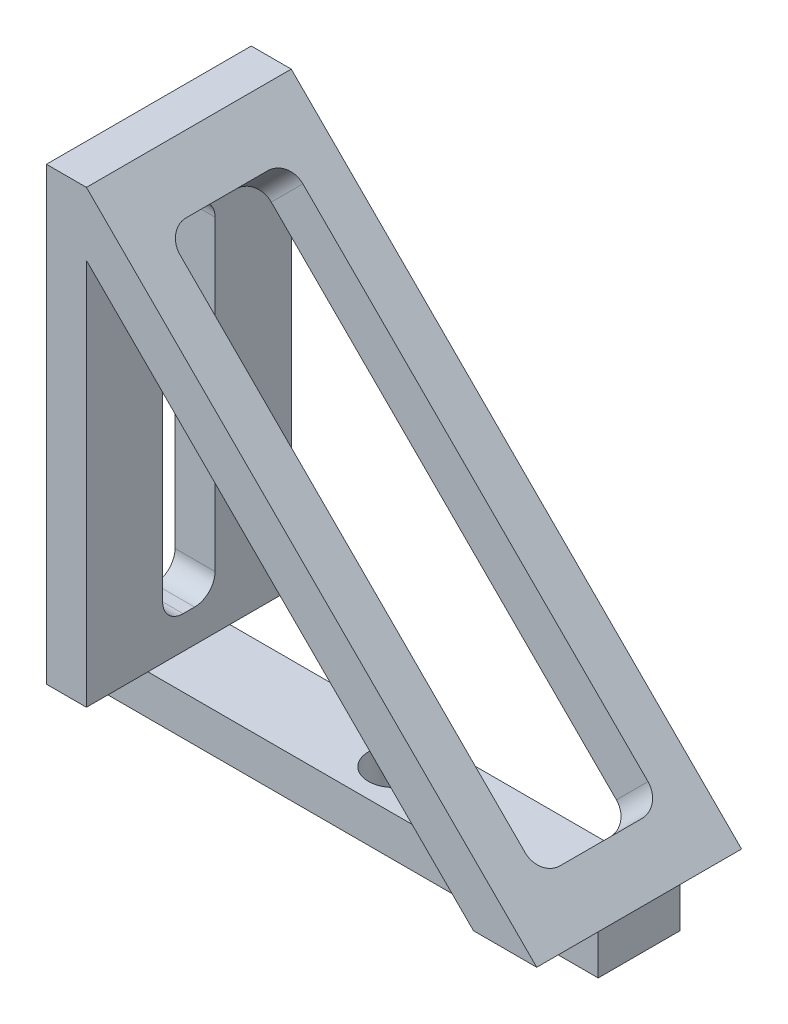
ISO-10303-21;
HEADER;
FILE_DESCRIPTION(('STEP AP214'),'2;1');
FILE_NAME('part.step','',(''),(''),'','','');
FILE_SCHEMA(('AUTOMOTIVE_DESIGN { 1 0 10303 214 1 1 1 1 }'));
ENDSEC;
DATA;
#1=APPLICATION_CONTEXT('core data for automotive mechanical design processes');
#2=APPLICATION_PROTOCOL_DEFINITION('international standard','automotive_design',2000,#1);
#3=PRODUCT_CONTEXT('',#1,'mechanical');
#4=PRODUCT('Part','Part','',(#3));
#5=PRODUCT_RELATED_PRODUCT_CATEGORY('part','',(#4));
#6=PRODUCT_DEFINITION_FORMATION('','',#4);
#7=PRODUCT_DEFINITION_CONTEXT('part definition',#1,'design');
#8=PRODUCT_DEFINITION('design','',#6,#7);
#9=PRODUCT_DEFINITION_SHAPE('','',#8);
#10=(LENGTH_UNIT() NAMED_UNIT(*) SI_UNIT(.MILLI.,.METRE.));
#11=(NAMED_UNIT(*) PLANE_ANGLE_UNIT() SI_UNIT($,.RADIAN.));
#12=(NAMED_UNIT(*) SI_UNIT($,.STERADIAN.) SOLID_ANGLE_UNIT());
#13=UNCERTAINTY_MEASURE_WITH_UNIT(LENGTH_MEASURE(1.E-05),#10,'distance_accuracy_value','');
#14=(GEOMETRIC_REPRESENTATION_CONTEXT(3) GLOBAL_UNCERTAINTY_ASSIGNED_CONTEXT((#13)) GLOBAL_UNIT_ASSIGNED_CONTEXT((#10,
#11,#12)) REPRESENTATION_CONTEXT('',''));
#15=CARTESIAN_POINT('',(0.,0.,0.));
#16=DIRECTION('',(0.,0.,1.));
#17=DIRECTION('',(1.,0.,0.));
#18=AXIS2_PLACEMENT_3D('',#15,#16,#17);
#19=CARTESIAN_POINT('',(-6.20000000000001,-6.19999999999997,15.875));
#20=DIRECTION('',(0.,1.,0.));
#21=DIRECTION('',(0.,0.,1.));
#22=AXIS2_PLACEMENT_3D('',#19,#20,#21);
#23=PLANE('',#22);
#24=DIRECTION('',(0.,0.,-1.));
#25=VECTOR('',#24,1.);
#26=CARTESIAN_POINT('',(69.8,-6.19999999999997,15.875));
#27=LINE('',#26,#25);
#28=CARTESIAN_POINT('',(69.8,-6.19999999999997,6.35));
#29=VERTEX_POINT('',#28);
#30=CARTESIAN_POINT('',(69.8,-6.19999999999997,-6.35));
#31=VERTEX_POINT('',#30);
#32=EDGE_CURVE('E246',#29,#31,#27,.T.);
#33=ORIENTED_EDGE('',*,*,#32,.F.);
#34=DIRECTION('',(1.,0.,0.));
#35=VECTOR('',#34,1.);
#36=CARTESIAN_POINT('',(-6.20100000000001,-6.19999999999997,6.35));
#37=LINE('',#36,#35);
#38=CARTESIAN_POINT('',(-6.20000000000001,-6.19999999999997,6.35));
#39=VERTEX_POINT('',#38);
#40=EDGE_CURVE('E228',#39,#29,#37,.T.);
#41=ORIENTED_EDGE('',*,*,#40,.F.);
#42=DIRECTION('',(0.,0.,-1.));
#43=VECTOR('',#42,1.);
#44=CARTESIAN_POINT('',(-6.20000000000001,-6.19999999999997,15.875));
#45=LINE('',#44,#43);
#46=CARTESIAN_POINT('',(-6.20000000000001,-6.19999999999997,-6.35));
#47=VERTEX_POINT('',#46);
#48=EDGE_CURVE('E255',#39,#47,#45,.T.);
#49=ORIENTED_EDGE('',*,*,#48,.T.);
#50=DIRECTION('',(1.,0.,0.));
#51=VECTOR('',#50,1.);
#52=CARTESIAN_POINT('',(-6.20100000000001,-6.19999999999997,-6.35));
#53=LINE('',#52,#51);
#54=EDGE_CURVE('E254',#47,#31,#53,.T.);
#55=ORIENTED_EDGE('',*,*,#54,.T.);
#56=EDGE_LOOP('',(#33,#41,#49,#55));
#57=FACE_BOUND('',#56,.T.);
#58=CARTESIAN_POINT('',(31.8,-6.19999999999997,0.));
#59=DIRECTION('',(0.,-1.,0.));
#60=DIRECTION('',(0.,0.,-1.));
#61=AXIS2_PLACEMENT_3D('',#58,#59,#60);
#62=CIRCLE('',#61,3.96874999999999);
#63=CARTESIAN_POINT('',(31.8,-6.19999999999997,-3.96874999999999));
#64=VERTEX_POINT('',#63);
#65=EDGE_CURVE('E603',#64,#64,#62,.T.);
#66=ORIENTED_EDGE('',*,*,#65,.F.);
#67=EDGE_LOOP('',(#66));
#68=FACE_BOUND('',#67,.T.);
#69=ADVANCED_FACE('F37',(#57,#68),#23,.F.);
#70=CARTESIAN_POINT('',(0.,0.,15.875));
#71=DIRECTION('',(0.,0.,-1.));
#72=DIRECTION('',(-1.,0.,0.));
#73=AXIS2_PLACEMENT_3D('',#70,#71,#72);
#74=PLANE('',#73);
#75=DIRECTION('',(0.,-1.,0.));
#76=VECTOR('',#75,1.);
#77=CARTESIAN_POINT('',(-6.20000000000001,69.8,15.875));
#78=LINE('',#77,#76);
#79=CARTESIAN_POINT('',(-6.20000000000001,69.8,15.875));
#80=VERTEX_POINT('',#79);
#81=CARTESIAN_POINT('',(-6.20000000000001,0.,15.875));
#82=VERTEX_POINT('',#81);
#83=EDGE_CURVE('E418',#80,#82,#78,.T.);
#84=ORIENTED_EDGE('',*,*,#83,.T.);
#85=DIRECTION('',(1.,0.,0.));
#86=VECTOR('',#85,1.);
#87=CARTESIAN_POINT('',(-6.20100000000001,0.,15.875));
#88=LINE('',#87,#86);
#89=CARTESIAN_POINT('',(0.,0.,15.875));
#90=VERTEX_POINT('',#89);
#91=EDGE_CURVE('E451',#82,#90,#88,.T.);
#92=ORIENTED_EDGE('',*,*,#91,.T.);
#93=DIRECTION('',(0.,-1.,0.));
#94=VECTOR('',#93,1.);
#95=CARTESIAN_POINT('',(0.,0.,15.875));
#96=LINE('',#95,#94);
#97=CARTESIAN_POINT('',(0.,60.,15.875));
#98=VERTEX_POINT('',#97);
#99=EDGE_CURVE('E390',#98,#90,#96,.T.);
#100=ORIENTED_EDGE('',*,*,#99,.F.);
#101=DIRECTION('',(-0.707106781186547,0.707106781186547,0.));
#102=VECTOR('',#101,1.);
#103=CARTESIAN_POINT('',(0.,60.,15.875));
#104=LINE('',#103,#102);
#105=CARTESIAN_POINT('',(60.,0.,15.875));
#106=VERTEX_POINT('',#105);
#107=EDGE_CURVE('E393',#106,#98,#104,.T.);
#108=ORIENTED_EDGE('',*,*,#107,.F.);
#109=CARTESIAN_POINT('',(69.8,0.,15.875));
#110=VERTEX_POINT('',#109);
#111=EDGE_CURVE('E575',#106,#110,#88,.T.);
#112=ORIENTED_EDGE('',*,*,#111,.T.);
#113=DIRECTION('',(-0.707106781186548,0.707106781186547,0.));
#114=VECTOR('',#113,1.);
#115=CARTESIAN_POINT('',(0.,69.8,15.875));
#116=LINE('',#115,#114);
#117=CARTESIAN_POINT('',(0.,69.8,15.875));
#118=VERTEX_POINT('',#117);
#119=EDGE_CURVE('E412',#110,#118,#116,.T.);
#120=ORIENTED_EDGE('',*,*,#119,.T.);
#121=DIRECTION('',(-1.,0.,0.));
#122=VECTOR('',#121,1.);
#123=CARTESIAN_POINT('',(-6.20000000000001,69.8,15.875));
#124=LINE('',#123,#122);
#125=EDGE_CURVE('E415',#118,#80,#124,.T.);
#126=ORIENTED_EDGE('',*,*,#125,.T.);
#127=EDGE_LOOP('',(#84,#92,#100,#108,#112,#120,#126));
#128=FACE_BOUND('',#127,.T.);
#129=ADVANCED_FACE('F486',(#128),#74,.F.);
#130=CARTESIAN_POINT('',(0.,0.,-15.875));
#131=DIRECTION('',(0.,0.,-1.));
#132=DIRECTION('',(-1.,0.,0.));
#133=AXIS2_PLACEMENT_3D('',#130,#131,#132);
#134=PLANE('',#133);
#135=DIRECTION('',(1.,0.,0.));
#136=VECTOR('',#135,1.);
#137=CARTESIAN_POINT('',(-6.20100000000001,0.,-15.875));
#138=LINE('',#137,#136);
#139=CARTESIAN_POINT('',(-6.20000000000001,0.,-15.875));
#140=VERTEX_POINT('',#139);
#141=CARTESIAN_POINT('',(0.,0.,-15.875));
#142=VERTEX_POINT('',#141);
#143=EDGE_CURVE('E435',#140,#142,#138,.T.);
#144=ORIENTED_EDGE('',*,*,#143,.F.);
#145=DIRECTION('',(0.,-1.,0.));
#146=VECTOR('',#145,1.);
#147=CARTESIAN_POINT('',(-6.20000000000001,69.8,-15.875));
#148=LINE('',#147,#146);
#149=CARTESIAN_POINT('',(-6.20000000000001,69.8,-15.875));
#150=VERTEX_POINT('',#149);
#151=EDGE_CURVE('E416',#150,#140,#148,.T.);
#152=ORIENTED_EDGE('',*,*,#151,.F.);
#153=DIRECTION('',(-1.,0.,0.));
#154=VECTOR('',#153,1.);
#155=CARTESIAN_POINT('',(-6.20000000000001,69.8,-15.875));
#156=LINE('',#155,#154);
#157=CARTESIAN_POINT('',(0.,69.8,-15.875));
#158=VERTEX_POINT('',#157);
#159=EDGE_CURVE('E423',#158,#150,#156,.T.);
#160=ORIENTED_EDGE('',*,*,#159,.F.);
#161=DIRECTION('',(-0.707106781186548,0.707106781186547,0.));
#162=VECTOR('',#161,1.);
#163=CARTESIAN_POINT('',(0.,69.8,-15.875));
#164=LINE('',#163,#162);
#165=CARTESIAN_POINT('',(69.8,0.,-15.875));
#166=VERTEX_POINT('',#165);
#167=EDGE_CURVE('E411',#166,#158,#164,.T.);
#168=ORIENTED_EDGE('',*,*,#167,.F.);
#169=CARTESIAN_POINT('',(60.,0.,-15.875));
#170=VERTEX_POINT('',#169);
#171=EDGE_CURVE('E439',#170,#166,#138,.T.);
#172=ORIENTED_EDGE('',*,*,#171,.F.);
#173=DIRECTION('',(-0.707106781186547,0.707106781186547,0.));
#174=VECTOR('',#173,1.);
#175=CARTESIAN_POINT('',(0.,60.,-15.875));
#176=LINE('',#175,#174);
#177=CARTESIAN_POINT('',(0.,60.,-15.875));
#178=VERTEX_POINT('',#177);
#179=EDGE_CURVE('E394',#170,#178,#176,.T.);
#180=ORIENTED_EDGE('',*,*,#179,.T.);
#181=DIRECTION('',(0.,-1.,0.));
#182=VECTOR('',#181,1.);
#183=CARTESIAN_POINT('',(0.,0.,-15.875));
#184=LINE('',#183,#182);
#185=EDGE_CURVE('E389',#178,#142,#184,.T.);
#186=ORIENTED_EDGE('',*,*,#185,.T.);
#187=EDGE_LOOP('',(#144,#152,#160,#168,#172,#180,#186));
#188=FACE_BOUND('',#187,.T.);
#189=ADVANCED_FACE('F433',(#188),#134,.T.);
#190=CARTESIAN_POINT('',(0.,69.8,15.875));
#191=DIRECTION('',(-0.707106781186547,-0.707106781186548,0.));
#192=DIRECTION('',(0.707106781186548,-0.707106781186547,0.));
#193=AXIS2_PLACEMENT_3D('',#190,#191,#192);
#194=PLANE('',#193);
#195=DIRECTION('',(0.707106781186548,-0.707106781186547,0.));
#196=VECTOR('',#195,1.);
#197=CARTESIAN_POINT('',(63.8913780286485,5.90862197135156,9.525));
#198=LINE('',#197,#196);
#199=CARTESIAN_POINT('',(8.15368600161884,61.6463139983812,9.525));
#200=VERTEX_POINT('',#199);
#201=CARTESIAN_POINT('',(61.6463139983812,8.15368600161885,9.525));
#202=VERTEX_POINT('',#201);
#203=EDGE_CURVE('E380',#200,#202,#198,.T.);
#204=ORIENTED_EDGE('',*,*,#203,.F.);
#205=CARTESIAN_POINT('',(8.15368600161884,61.6463139983812,6.35));
#206=DIRECTION('',(-0.707106781186547,-0.707106781186548,0.));
#207=DIRECTION('',(0.707106781186548,-0.707106781186547,0.));
#208=AXIS2_PLACEMENT_3D('',#205,#206,#207);
#209=CIRCLE('',#208,3.175);
#210=CARTESIAN_POINT('',(5.90862197135155,63.8913780286485,6.35));
#211=VERTEX_POINT('',#210);
#212=EDGE_CURVE('E300',#200,#211,#209,.T.);
#213=ORIENTED_EDGE('',*,*,#212,.T.);
#214=DIRECTION('',(0.,0.,1.));
#215=VECTOR('',#214,1.);
#216=CARTESIAN_POINT('',(5.90862197135155,63.8913780286485,9.525));
#217=LINE('',#216,#215);
#218=CARTESIAN_POINT('',(5.90862197135155,63.8913780286485,-6.34999999999999));
#219=VERTEX_POINT('',#218);
#220=EDGE_CURVE('E377',#219,#211,#217,.T.);
#221=ORIENTED_EDGE('',*,*,#220,.F.);
#222=CARTESIAN_POINT('',(8.15368600161883,61.6463139983812,-6.35));
#223=DIRECTION('',(-0.707106781186547,-0.707106781186548,0.));
#224=DIRECTION('',(0.707106781186548,-0.707106781186547,0.));
#225=AXIS2_PLACEMENT_3D('',#222,#223,#224);
#226=CIRCLE('',#225,3.175);
#227=CARTESIAN_POINT('',(8.15368600161884,61.6463139983812,-9.525));
#228=VERTEX_POINT('',#227);
#229=EDGE_CURVE('E296',#219,#228,#226,.T.);
#230=ORIENTED_EDGE('',*,*,#229,.T.);
#231=DIRECTION('',(-0.707106781186548,0.707106781186547,0.));
#232=VECTOR('',#231,1.);
#233=CARTESIAN_POINT('',(63.8913780286485,5.90862197135156,-9.525));
#234=LINE('',#233,#232);
#235=CARTESIAN_POINT('',(61.6463139983812,8.15368600161885,-9.525));
#236=VERTEX_POINT('',#235);
#237=EDGE_CURVE('E374',#236,#228,#234,.T.);
#238=ORIENTED_EDGE('',*,*,#237,.F.);
#239=CARTESIAN_POINT('',(61.6463139983812,8.15368600161884,-6.35));
#240=DIRECTION('',(-0.707106781186547,-0.707106781186548,0.));
#241=DIRECTION('',(0.707106781186548,-0.707106781186547,0.));
#242=AXIS2_PLACEMENT_3D('',#239,#240,#241);
#243=CIRCLE('',#242,3.175);
#244=CARTESIAN_POINT('',(63.8913780286485,5.90862197135156,-6.34999999999999));
#245=VERTEX_POINT('',#244);
#246=EDGE_CURVE('E292',#236,#245,#243,.T.);
#247=ORIENTED_EDGE('',*,*,#246,.T.);
#248=DIRECTION('',(0.,0.,-1.));
#249=VECTOR('',#248,1.);
#250=CARTESIAN_POINT('',(63.8913780286485,5.90862197135156,9.525));
#251=LINE('',#250,#249);
#252=CARTESIAN_POINT('',(63.8913780286485,5.90862197135156,6.35));
#253=VERTEX_POINT('',#252);
#254=EDGE_CURVE('E383',#253,#245,#251,.T.);
#255=ORIENTED_EDGE('',*,*,#254,.F.);
#256=CARTESIAN_POINT('',(61.6463139983812,8.15368600161884,6.35));
#257=DIRECTION('',(-0.707106781186547,-0.707106781186548,0.));
#258=DIRECTION('',(0.707106781186548,-0.707106781186547,0.));
#259=AXIS2_PLACEMENT_3D('',#256,#257,#258);
#260=CIRCLE('',#259,3.175);
#261=EDGE_CURVE('E288',#253,#202,#260,.T.);
#262=ORIENTED_EDGE('',*,*,#261,.T.);
#263=EDGE_LOOP('',(#204,#213,#221,#230,#238,#247,#255,#262));
#264=FACE_BOUND('',#263,.T.);
#265=ORIENTED_EDGE('',*,*,#167,.T.);
#266=DIRECTION('',(0.,0.,-1.));
#267=VECTOR('',#266,1.);
#268=CARTESIAN_POINT('',(0.,69.8,15.875));
#269=LINE('',#268,#267);
#270=EDGE_CURVE('E265',#118,#158,#269,.T.);
#271=ORIENTED_EDGE('',*,*,#270,.F.);
#272=ORIENTED_EDGE('',*,*,#119,.F.);
#273=DIRECTION('',(0.,0.,-1.));
#274=VECTOR('',#273,1.);
#275=CARTESIAN_POINT('',(69.8,0.,15.875));
#276=LINE('',#275,#274);
#277=CARTESIAN_POINT('',(69.8,0.,6.35));
#278=VERTEX_POINT('',#277);
#279=EDGE_CURVE('E256',#110,#278,#276,.T.);
#280=ORIENTED_EDGE('',*,*,#279,.T.);
#281=CARTESIAN_POINT('',(69.8,0.,-6.35));
#282=VERTEX_POINT('',#281);
#283=EDGE_CURVE('E248',#278,#282,#276,.T.);
#284=ORIENTED_EDGE('',*,*,#283,.T.);
#285=DIRECTION('',(0.,0.,1.));
#286=VECTOR('',#285,1.);
#287=CARTESIAN_POINT('',(69.8,0.,-15.875));
#288=LINE('',#287,#286);
#289=EDGE_CURVE('E559',#166,#282,#288,.T.);
#290=ORIENTED_EDGE('',*,*,#289,.F.);
#291=EDGE_LOOP('',(#265,#271,#272,#280,#284,#290));
#292=FACE_BOUND('',#291,.T.);
#293=ADVANCED_FACE('F501',(#264,#292),#194,.F.);
#294=CARTESIAN_POINT('',(-6.20000000000001,69.8,15.875));
#295=DIRECTION('',(0.,-1.,0.));
#296=DIRECTION('',(1.,0.,0.));
#297=AXIS2_PLACEMENT_3D('',#294,#295,#296);
#298=PLANE('',#297);
#299=ORIENTED_EDGE('',*,*,#159,.T.);
#300=DIRECTION('',(0.,0.,-1.));
#301=VECTOR('',#300,1.);
#302=CARTESIAN_POINT('',(-6.20000000000001,69.8,15.875));
#303=LINE('',#302,#301);
#304=EDGE_CURVE('E258',#80,#150,#303,.T.);
#305=ORIENTED_EDGE('',*,*,#304,.F.);
#306=ORIENTED_EDGE('',*,*,#125,.F.);
#307=ORIENTED_EDGE('',*,*,#270,.T.);
#308=EDGE_LOOP('',(#299,#305,#306,#307));
#309=FACE_BOUND('',#308,.T.);
#310=ADVANCED_FACE('F498',(#309),#298,.F.);
#311=CARTESIAN_POINT('',(-6.20000000000001,69.8,15.875));
#312=DIRECTION('',(1.,0.,0.));
#313=DIRECTION('',(0.,0.,-1.));
#314=AXIS2_PLACEMENT_3D('',#311,#312,#313);
#315=PLANE('',#314);
#316=DIRECTION('',(0.,0.,1.));
#317=VECTOR('',#316,1.);
#318=CARTESIAN_POINT('',(-6.20000000000001,5.08,4.064));
#319=LINE('',#318,#317);
#320=CARTESIAN_POINT('',(-6.20000000000001,5.08,-0.889));
#321=VERTEX_POINT('',#320);
#322=CARTESIAN_POINT('',(-6.20000000000001,5.08,0.889));
#323=VERTEX_POINT('',#322);
#324=EDGE_CURVE('E454',#321,#323,#319,.T.);
#325=ORIENTED_EDGE('',*,*,#324,.F.);
#326=CARTESIAN_POINT('',(-6.20000000000001,8.255,-0.889));
#327=DIRECTION('',(1.,0.,0.));
#328=DIRECTION('',(0.,0.,-1.));
#329=AXIS2_PLACEMENT_3D('',#326,#327,#328);
#330=CIRCLE('',#329,3.175);
#331=CARTESIAN_POINT('',(-6.20000000000001,8.255,-4.064));
#332=VERTEX_POINT('',#331);
#333=EDGE_CURVE('E329',#321,#332,#330,.T.);
#334=ORIENTED_EDGE('',*,*,#333,.T.);
#335=DIRECTION('',(0.,-1.,0.));
#336=VECTOR('',#335,1.);
#337=CARTESIAN_POINT('',(-6.20000000000001,5.08,-4.064));
#338=LINE('',#337,#336);
#339=CARTESIAN_POINT('',(-6.20000000000001,55.825,-4.064));
#340=VERTEX_POINT('',#339);
#341=EDGE_CURVE('E344',#340,#332,#338,.T.);
#342=ORIENTED_EDGE('',*,*,#341,.F.);
#343=CARTESIAN_POINT('',(-6.20000000000001,55.825,-0.889));
#344=DIRECTION('',(1.,0.,0.));
#345=DIRECTION('',(0.,0.,-1.));
#346=AXIS2_PLACEMENT_3D('',#343,#344,#345);
#347=CIRCLE('',#346,3.175);
#348=CARTESIAN_POINT('',(-6.20000000000001,59.,-0.889));
#349=VERTEX_POINT('',#348);
#350=EDGE_CURVE('E11',#340,#349,#347,.T.);
#351=ORIENTED_EDGE('',*,*,#350,.T.);
#352=DIRECTION('',(0.,0.,-1.));
#353=VECTOR('',#352,1.);
#354=CARTESIAN_POINT('',(-6.20000000000001,59.,4.064));
#355=LINE('',#354,#353);
#356=CARTESIAN_POINT('',(-6.20000000000001,59.,0.889));
#357=VERTEX_POINT('',#356);
#358=EDGE_CURVE('E353',#357,#349,#355,.T.);
#359=ORIENTED_EDGE('',*,*,#358,.F.);
#360=CARTESIAN_POINT('',(-6.20000000000001,55.825,0.889));
#361=DIRECTION('',(1.,0.,0.));
#362=DIRECTION('',(0.,0.,-1.));
#363=AXIS2_PLACEMENT_3D('',#360,#361,#362);
#364=CIRCLE('',#363,3.175);
#365=CARTESIAN_POINT('',(-6.20000000000001,55.825,4.064));
#366=VERTEX_POINT('',#365);
#367=EDGE_CURVE('E332',#357,#366,#364,.T.);
#368=ORIENTED_EDGE('',*,*,#367,.T.);
#369=DIRECTION('',(0.,1.,0.));
#370=VECTOR('',#369,1.);
#371=CARTESIAN_POINT('',(-6.20000000000001,5.08,4.064));
#372=LINE('',#371,#370);
#373=CARTESIAN_POINT('',(-6.20000000000001,8.255,4.064));
#374=VERTEX_POINT('',#373);
#375=EDGE_CURVE('E450',#374,#366,#372,.T.);
#376=ORIENTED_EDGE('',*,*,#375,.F.);
#377=CARTESIAN_POINT('',(-6.20000000000001,8.255,0.889));
#378=DIRECTION('',(1.,0.,0.));
#379=DIRECTION('',(0.,0.,-1.));
#380=AXIS2_PLACEMENT_3D('',#377,#378,#379);
#381=CIRCLE('',#380,3.175);
#382=EDGE_CURVE('E325',#374,#323,#381,.T.);
#383=ORIENTED_EDGE('',*,*,#382,.T.);
#384=EDGE_LOOP('',(#325,#334,#342,#351,#359,#368,#376,#383));
#385=FACE_BOUND('',#384,.T.);
#386=ORIENTED_EDGE('',*,*,#48,.F.);
#387=DIRECTION('',(0.,-1.,0.));
#388=VECTOR('',#387,1.);
#389=CARTESIAN_POINT('',(-6.20000000000001,-6.19999999999997,6.35));
#390=LINE('',#389,#388);
#391=CARTESIAN_POINT('',(-6.20000000000001,0.,6.35));
#392=VERTEX_POINT('',#391);
#393=EDGE_CURVE('E235',#392,#39,#390,.T.);
#394=ORIENTED_EDGE('',*,*,#393,.F.);
#395=DIRECTION('',(0.,0.,-1.));
#396=VECTOR('',#395,1.);
#397=CARTESIAN_POINT('',(-6.20000000000001,0.,15.875));
#398=LINE('',#397,#396);
#399=EDGE_CURVE('E250',#82,#392,#398,.T.);
#400=ORIENTED_EDGE('',*,*,#399,.F.);
#401=ORIENTED_EDGE('',*,*,#83,.F.);
#402=ORIENTED_EDGE('',*,*,#304,.T.);
#403=ORIENTED_EDGE('',*,*,#151,.T.);
#404=DIRECTION('',(0.,0.,-1.));
#405=VECTOR('',#404,1.);
#406=CARTESIAN_POINT('',(-6.20000000000001,0.,-15.875));
#407=LINE('',#406,#405);
#408=CARTESIAN_POINT('',(-6.20000000000001,0.,-6.35));
#409=VERTEX_POINT('',#408);
#410=EDGE_CURVE('E428',#409,#140,#407,.T.);
#411=ORIENTED_EDGE('',*,*,#410,.F.);
#412=DIRECTION('',(0.,1.,0.));
#413=VECTOR('',#412,1.);
#414=CARTESIAN_POINT('',(-6.20000000000001,-6.19999999999997,-6.35));
#415=LINE('',#414,#413);
#416=EDGE_CURVE('E583',#47,#409,#415,.T.);
#417=ORIENTED_EDGE('',*,*,#416,.F.);
#418=EDGE_LOOP('',(#386,#394,#400,#401,#402,#403,#411,#417));
#419=FACE_BOUND('',#418,.T.);
#420=ADVANCED_FACE('F351',(#385,#419),#315,.F.);
#421=CARTESIAN_POINT('',(69.8,0.,15.875));
#422=DIRECTION('',(-1.,0.,0.));
#423=DIRECTION('',(0.,0.,1.));
#424=AXIS2_PLACEMENT_3D('',#421,#422,#423);
#425=PLANE('',#424);
#426=ORIENTED_EDGE('',*,*,#283,.F.);
#427=DIRECTION('',(0.,1.,0.));
#428=VECTOR('',#427,1.);
#429=CARTESIAN_POINT('',(69.8,-6.19999999999997,6.35));
#430=LINE('',#429,#428);
#431=EDGE_CURVE('E232',#29,#278,#430,.T.);
#432=ORIENTED_EDGE('',*,*,#431,.F.);
#433=ORIENTED_EDGE('',*,*,#32,.T.);
#434=DIRECTION('',(0.,-1.,0.));
#435=VECTOR('',#434,1.);
#436=CARTESIAN_POINT('',(69.8,-6.19999999999997,-6.35));
#437=LINE('',#436,#435);
#438=EDGE_CURVE('E444',#282,#31,#437,.T.);
#439=ORIENTED_EDGE('',*,*,#438,.F.);
#440=EDGE_LOOP('',(#426,#432,#433,#439));
#441=FACE_BOUND('',#440,.T.);
#442=ADVANCED_FACE('F244',(#441),#425,.F.);
#443=CARTESIAN_POINT('',(0.,0.,15.875));
#444=DIRECTION('',(1.,0.,0.));
#445=DIRECTION('',(0.,0.,-1.));
#446=AXIS2_PLACEMENT_3D('',#443,#444,#445);
#447=PLANE('',#446);
#448=DIRECTION('',(0.,1.,0.));
#449=VECTOR('',#448,1.);
#450=CARTESIAN_POINT('',(0.,5.08,-4.064));
#451=LINE('',#450,#449);
#452=CARTESIAN_POINT('',(0.,8.255,-4.064));
#453=VERTEX_POINT('',#452);
#454=CARTESIAN_POINT('',(0.,55.825,-4.064));
#455=VERTEX_POINT('',#454);
#456=EDGE_CURVE('E337',#453,#455,#451,.T.);
#457=ORIENTED_EDGE('',*,*,#456,.F.);
#458=CARTESIAN_POINT('',(0.,8.255,-0.889));
#459=DIRECTION('',(1.,0.,0.));
#460=DIRECTION('',(0.,0.,-1.));
#461=AXIS2_PLACEMENT_3D('',#458,#459,#460);
#462=CIRCLE('',#461,3.175);
#463=CARTESIAN_POINT('',(0.,5.08,-0.889));
#464=VERTEX_POINT('',#463);
#465=EDGE_CURVE('E327',#453,#464,#462,.F.);
#466=ORIENTED_EDGE('',*,*,#465,.T.);
#467=DIRECTION('',(0.,0.,-1.));
#468=VECTOR('',#467,1.);
#469=CARTESIAN_POINT('',(0.,5.08,4.064));
#470=LINE('',#469,#468);
#471=CARTESIAN_POINT('',(0.,5.08,0.889));
#472=VERTEX_POINT('',#471);
#473=EDGE_CURVE('E359',#472,#464,#470,.T.);
#474=ORIENTED_EDGE('',*,*,#473,.F.);
#475=CARTESIAN_POINT('',(0.,8.255,0.889));
#476=DIRECTION('',(1.,0.,0.));
#477=DIRECTION('',(0.,0.,-1.));
#478=AXIS2_PLACEMENT_3D('',#475,#476,#477);
#479=CIRCLE('',#478,3.175);
#480=CARTESIAN_POINT('',(0.,8.255,4.064));
#481=VERTEX_POINT('',#480);
#482=EDGE_CURVE('E323',#472,#481,#479,.F.);
#483=ORIENTED_EDGE('',*,*,#482,.T.);
#484=DIRECTION('',(0.,-1.,0.));
#485=VECTOR('',#484,1.);
#486=CARTESIAN_POINT('',(0.,5.08,4.064));
#487=LINE('',#486,#485);
#488=CARTESIAN_POINT('',(0.,55.825,4.064));
#489=VERTEX_POINT('',#488);
#490=EDGE_CURVE('E365',#489,#481,#487,.T.);
#491=ORIENTED_EDGE('',*,*,#490,.F.);
#492=CARTESIAN_POINT('',(0.,55.825,0.889));
#493=DIRECTION('',(1.,0.,0.));
#494=DIRECTION('',(0.,0.,-1.));
#495=AXIS2_PLACEMENT_3D('',#492,#493,#494);
#496=CIRCLE('',#495,3.175);
#497=CARTESIAN_POINT('',(0.,59.,0.889));
#498=VERTEX_POINT('',#497);
#499=EDGE_CURVE('E52',#489,#498,#496,.F.);
#500=ORIENTED_EDGE('',*,*,#499,.T.);
#501=DIRECTION('',(0.,0.,1.));
#502=VECTOR('',#501,1.);
#503=CARTESIAN_POINT('',(0.,59.,4.064));
#504=LINE('',#503,#502);
#505=CARTESIAN_POINT('',(0.,59.,-0.889));
#506=VERTEX_POINT('',#505);
#507=EDGE_CURVE('E338',#506,#498,#504,.T.);
#508=ORIENTED_EDGE('',*,*,#507,.F.);
#509=CARTESIAN_POINT('',(0.,55.825,-0.889));
#510=DIRECTION('',(1.,0.,0.));
#511=DIRECTION('',(0.,0.,-1.));
#512=AXIS2_PLACEMENT_3D('',#509,#510,#511);
#513=CIRCLE('',#512,3.175);
#514=EDGE_CURVE('E45',#506,#455,#513,.F.);
#515=ORIENTED_EDGE('',*,*,#514,.T.);
#516=EDGE_LOOP('',(#457,#466,#474,#483,#491,#500,#508,#515));
#517=FACE_BOUND('',#516,.T.);
#518=ORIENTED_EDGE('',*,*,#185,.F.);
#519=DIRECTION('',(0.,0.,-1.));
#520=VECTOR('',#519,1.);
#521=CARTESIAN_POINT('',(0.,60.,15.875));
#522=LINE('',#521,#520);
#523=EDGE_CURVE('E396',#98,#178,#522,.T.);
#524=ORIENTED_EDGE('',*,*,#523,.F.);
#525=ORIENTED_EDGE('',*,*,#99,.T.);
#526=DIRECTION('',(0.,0.,-1.));
#527=VECTOR('',#526,1.);
#528=CARTESIAN_POINT('',(0.,0.,15.875));
#529=LINE('',#528,#527);
#530=CARTESIAN_POINT('',(0.,0.,6.35));
#531=VERTEX_POINT('',#530);
#532=EDGE_CURVE('E408',#90,#531,#529,.T.);
#533=ORIENTED_EDGE('',*,*,#532,.T.);
#534=CARTESIAN_POINT('',(0.,0.,-6.35));
#535=VERTEX_POINT('',#534);
#536=EDGE_CURVE('E406',#531,#535,#529,.T.);
#537=ORIENTED_EDGE('',*,*,#536,.T.);
#538=DIRECTION('',(0.,0.,1.));
#539=VECTOR('',#538,1.);
#540=CARTESIAN_POINT('',(0.,0.,15.875));
#541=LINE('',#540,#539);
#542=EDGE_CURVE('E448',#142,#535,#541,.T.);
#543=ORIENTED_EDGE('',*,*,#542,.F.);
#544=EDGE_LOOP('',(#518,#524,#525,#533,#537,#543));
#545=FACE_BOUND('',#544,.T.);
#546=ADVANCED_FACE('F335',(#517,#545),#447,.T.);
#547=CARTESIAN_POINT('',(60.,0.,15.875));
#548=DIRECTION('',(0.,1.,0.));
#549=DIRECTION('',(0.,0.,1.));
#550=AXIS2_PLACEMENT_3D('',#547,#548,#549);
#551=PLANE('',#550);
#552=CARTESIAN_POINT('',(31.8,0.,0.));
#553=DIRECTION('',(0.,1.,0.));
#554=DIRECTION('',(0.,0.,1.));
#555=AXIS2_PLACEMENT_3D('',#552,#553,#554);
#556=CIRCLE('',#555,3.96874999999999);
#557=CARTESIAN_POINT('',(31.8,0.,3.96874999999999));
#558=VERTEX_POINT('',#557);
#559=EDGE_CURVE('E586',#558,#558,#556,.T.);
#560=ORIENTED_EDGE('',*,*,#559,.F.);
#561=EDGE_LOOP('',(#560));
#562=FACE_BOUND('',#561,.T.);
#563=DIRECTION('',(1.,0.,0.));
#564=VECTOR('',#563,1.);
#565=CARTESIAN_POINT('',(-6.20100000000001,0.,6.35));
#566=LINE('',#565,#564);
#567=CARTESIAN_POINT('',(60.,0.,6.35));
#568=VERTEX_POINT('',#567);
#569=EDGE_CURVE('E581',#531,#568,#566,.T.);
#570=ORIENTED_EDGE('',*,*,#569,.T.);
#571=DIRECTION('',(0.,0.,-1.));
#572=VECTOR('',#571,1.);
#573=CARTESIAN_POINT('',(60.,0.,15.875));
#574=LINE('',#573,#572);
#575=CARTESIAN_POINT('',(60.,0.,-6.35));
#576=VERTEX_POINT('',#575);
#577=EDGE_CURVE('E407',#568,#576,#574,.T.);
#578=ORIENTED_EDGE('',*,*,#577,.T.);
#579=DIRECTION('',(1.,0.,0.));
#580=VECTOR('',#579,1.);
#581=CARTESIAN_POINT('',(-6.20100000000001,0.,-6.35));
#582=LINE('',#581,#580);
#583=EDGE_CURVE('E441',#535,#576,#582,.T.);
#584=ORIENTED_EDGE('',*,*,#583,.F.);
#585=ORIENTED_EDGE('',*,*,#536,.F.);
#586=EDGE_LOOP('',(#570,#578,#584,#585));
#587=FACE_BOUND('',#586,.T.);
#588=ADVANCED_FACE('F641',(#562,#587),#551,.T.);
#589=CARTESIAN_POINT('',(0.,60.,15.875));
#590=DIRECTION('',(-0.707106781186548,-0.707106781186548,0.));
#591=DIRECTION('',(0.707106781186548,-0.707106781186548,0.));
#592=AXIS2_PLACEMENT_3D('',#589,#590,#591);
#593=PLANE('',#592);
#594=DIRECTION('',(-0.707106781186548,0.707106781186548,0.));
#595=VECTOR('',#594,1.);
#596=CARTESIAN_POINT('',(58.9913780286484,1.00862197135154,-9.525));
#597=LINE('',#596,#595);
#598=CARTESIAN_POINT('',(56.7463139983812,3.25368600161883,-9.525));
#599=VERTEX_POINT('',#598);
#600=CARTESIAN_POINT('',(3.25368600161882,56.7463139983812,-9.525));
#601=VERTEX_POINT('',#600);
#602=EDGE_CURVE('E371',#599,#601,#597,.T.);
#603=ORIENTED_EDGE('',*,*,#602,.T.);
#604=CARTESIAN_POINT('',(3.25368600161884,56.7463139983812,-6.35));
#605=DIRECTION('',(-0.707106781186548,-0.707106781186548,0.));
#606=DIRECTION('',(0.707106781186548,-0.707106781186548,0.));
#607=AXIS2_PLACEMENT_3D('',#604,#605,#606);
#608=CIRCLE('',#607,3.175);
#609=CARTESIAN_POINT('',(1.00862197135155,58.9913780286485,-6.35));
#610=VERTEX_POINT('',#609);
#611=EDGE_CURVE('E298',#601,#610,#608,.F.);
#612=ORIENTED_EDGE('',*,*,#611,.T.);
#613=DIRECTION('',(0.,0.,1.));
#614=VECTOR('',#613,1.);
#615=CARTESIAN_POINT('',(1.00862197135155,58.9913780286485,9.525));
#616=LINE('',#615,#614);
#617=CARTESIAN_POINT('',(1.00862197135155,58.9913780286485,6.35));
#618=VERTEX_POINT('',#617);
#619=EDGE_CURVE('E386',#610,#618,#616,.T.);
#620=ORIENTED_EDGE('',*,*,#619,.T.);
#621=CARTESIAN_POINT('',(3.25368600161884,56.7463139983812,6.35));
#622=DIRECTION('',(-0.707106781186548,-0.707106781186548,0.));
#623=DIRECTION('',(0.707106781186548,-0.707106781186548,0.));
#624=AXIS2_PLACEMENT_3D('',#621,#622,#623);
#625=CIRCLE('',#624,3.175);
#626=CARTESIAN_POINT('',(3.25368600161883,56.7463139983812,9.525));
#627=VERTEX_POINT('',#626);
#628=EDGE_CURVE('E302',#618,#627,#625,.F.);
#629=ORIENTED_EDGE('',*,*,#628,.T.);
#630=DIRECTION('',(0.707106781186548,-0.707106781186548,0.));
#631=VECTOR('',#630,1.);
#632=CARTESIAN_POINT('',(58.9913780286484,1.00862197135154,9.525));
#633=LINE('',#632,#631);
#634=CARTESIAN_POINT('',(56.7463139983812,3.25368600161883,9.525));
#635=VERTEX_POINT('',#634);
#636=EDGE_CURVE('E358',#627,#635,#633,.T.);
#637=ORIENTED_EDGE('',*,*,#636,.T.);
#638=CARTESIAN_POINT('',(56.7463139983812,3.25368600161884,6.35));
#639=DIRECTION('',(-0.707106781186548,-0.707106781186548,0.));
#640=DIRECTION('',(0.707106781186548,-0.707106781186548,0.));
#641=AXIS2_PLACEMENT_3D('',#638,#639,#640);
#642=CIRCLE('',#641,3.175);
#643=CARTESIAN_POINT('',(58.9913780286485,1.00862197135156,6.35));
#644=VERTEX_POINT('',#643);
#645=EDGE_CURVE('E290',#635,#644,#642,.F.);
#646=ORIENTED_EDGE('',*,*,#645,.T.);
#647=DIRECTION('',(0.,0.,-1.));
#648=VECTOR('',#647,1.);
#649=CARTESIAN_POINT('',(58.9913780286485,1.00862197135156,9.525));
#650=LINE('',#649,#648);
#651=CARTESIAN_POINT('',(58.9913780286485,1.00862197135156,-6.35));
#652=VERTEX_POINT('',#651);
#653=EDGE_CURVE('E362',#644,#652,#650,.T.);
#654=ORIENTED_EDGE('',*,*,#653,.T.);
#655=CARTESIAN_POINT('',(56.7463139983812,3.25368600161884,-6.35));
#656=DIRECTION('',(-0.707106781186548,-0.707106781186548,0.));
#657=DIRECTION('',(0.707106781186548,-0.707106781186548,0.));
#658=AXIS2_PLACEMENT_3D('',#655,#656,#657);
#659=CIRCLE('',#658,3.175);
#660=EDGE_CURVE('E294',#652,#599,#659,.F.);
#661=ORIENTED_EDGE('',*,*,#660,.T.);
#662=EDGE_LOOP('',(#603,#612,#620,#629,#637,#646,#654,#661));
#663=FACE_BOUND('',#662,.T.);
#664=ORIENTED_EDGE('',*,*,#179,.F.);
#665=EDGE_CURVE('E403',#576,#170,#574,.T.);
#666=ORIENTED_EDGE('',*,*,#665,.F.);
#667=ORIENTED_EDGE('',*,*,#577,.F.);
#668=EDGE_CURVE('E404',#106,#568,#574,.T.);
#669=ORIENTED_EDGE('',*,*,#668,.F.);
#670=ORIENTED_EDGE('',*,*,#107,.T.);
#671=ORIENTED_EDGE('',*,*,#523,.T.);
#672=EDGE_LOOP('',(#664,#666,#667,#669,#670,#671));
#673=FACE_BOUND('',#672,.T.);
#674=ADVANCED_FACE('F528',(#663,#673),#593,.T.);
#675=CARTESIAN_POINT('',(-35.1923780286484,22.7903780286485,9.525));
#676=DIRECTION('',(-0.707106781186548,0.707106781186547,0.));
#677=DIRECTION('',(-0.707106781186547,-0.707106781186548,0.));
#678=AXIS2_PLACEMENT_3D('',#675,#676,#677);
#679=PLANE('',#678);
#680=ORIENTED_EDGE('',*,*,#619,.F.);
#681=DIRECTION('',(0.707106781186547,0.707106781186548,0.));
#682=VECTOR('',#681,1.);
#683=CARTESIAN_POINT('',(5.90862197135155,63.8913780286485,-6.35));
#684=LINE('',#683,#682);
#685=EDGE_CURVE('E285',#610,#219,#684,.T.);
#686=ORIENTED_EDGE('',*,*,#685,.T.);
#687=ORIENTED_EDGE('',*,*,#220,.T.);
#688=DIRECTION('',(0.707106781186547,0.707106781186548,0.));
#689=VECTOR('',#688,1.);
#690=CARTESIAN_POINT('',(1.00862197135155,58.9913780286484,6.35));
#691=LINE('',#690,#689);
#692=EDGE_CURVE('E283',#211,#618,#691,.F.);
#693=ORIENTED_EDGE('',*,*,#692,.T.);
#694=EDGE_LOOP('',(#680,#686,#687,#693));
#695=FACE_BOUND('',#694,.T.);
#696=ADVANCED_FACE('F552',(#695),#679,.F.);
#697=CARTESIAN_POINT('',(22.7903780286485,-35.1923780286484,9.525));
#698=DIRECTION('',(0.,0.,1.));
#699=DIRECTION('',(1.,0.,0.));
#700=AXIS2_PLACEMENT_3D('',#697,#698,#699);
#701=PLANE('',#700);
#702=ORIENTED_EDGE('',*,*,#203,.T.);
#703=DIRECTION('',(0.707106781186547,0.707106781186548,0.));
#704=VECTOR('',#703,1.);
#705=CARTESIAN_POINT('',(56.7463139983812,3.25368600161883,9.525));
#706=LINE('',#705,#704);
#707=EDGE_CURVE('E276',#202,#635,#706,.F.);
#708=ORIENTED_EDGE('',*,*,#707,.T.);
#709=ORIENTED_EDGE('',*,*,#636,.F.);
#710=DIRECTION('',(0.707106781186547,0.707106781186548,0.));
#711=VECTOR('',#710,1.);
#712=CARTESIAN_POINT('',(8.15368600161884,61.6463139983812,9.525));
#713=LINE('',#712,#711);
#714=EDGE_CURVE('E273',#627,#200,#713,.T.);
#715=ORIENTED_EDGE('',*,*,#714,.T.);
#716=EDGE_LOOP('',(#702,#708,#709,#715));
#717=FACE_BOUND('',#716,.T.);
#718=ADVANCED_FACE('F533',(#717),#701,.F.);
#719=CARTESIAN_POINT('',(22.7903780286485,-35.1923780286484,9.525));
#720=DIRECTION('',(0.707106781186548,-0.707106781186547,0.));
#721=DIRECTION('',(0.707106781186547,0.707106781186548,0.));
#722=AXIS2_PLACEMENT_3D('',#719,#720,#721);
#723=PLANE('',#722);
#724=ORIENTED_EDGE('',*,*,#653,.F.);
#725=DIRECTION('',(0.707106781186547,0.707106781186548,0.));
#726=VECTOR('',#725,1.);
#727=CARTESIAN_POINT('',(63.8913780286485,5.90862197135156,6.35));
#728=LINE('',#727,#726);
#729=EDGE_CURVE('E270',#644,#253,#728,.T.);
#730=ORIENTED_EDGE('',*,*,#729,.T.);
#731=ORIENTED_EDGE('',*,*,#254,.T.);
#732=DIRECTION('',(0.707106781186547,0.707106781186548,0.));
#733=VECTOR('',#732,1.);
#734=CARTESIAN_POINT('',(58.9913780286485,1.00862197135155,-6.35));
#735=LINE('',#734,#733);
#736=EDGE_CURVE('E268',#245,#652,#735,.F.);
#737=ORIENTED_EDGE('',*,*,#736,.T.);
#738=EDGE_LOOP('',(#724,#730,#731,#737));
#739=FACE_BOUND('',#738,.T.);
#740=ADVANCED_FACE('F540',(#739),#723,.F.);
#741=CARTESIAN_POINT('',(22.7903780286485,-35.1923780286484,-9.525));
#742=DIRECTION('',(0.,0.,-1.));
#743=DIRECTION('',(-1.,0.,0.));
#744=AXIS2_PLACEMENT_3D('',#741,#742,#743);
#745=PLANE('',#744);
#746=ORIENTED_EDGE('',*,*,#602,.F.);
#747=DIRECTION('',(0.707106781186547,0.707106781186548,0.));
#748=VECTOR('',#747,1.);
#749=CARTESIAN_POINT('',(61.6463139983812,8.15368600161884,-9.525));
#750=LINE('',#749,#748);
#751=EDGE_CURVE('E280',#599,#236,#750,.T.);
#752=ORIENTED_EDGE('',*,*,#751,.T.);
#753=ORIENTED_EDGE('',*,*,#237,.T.);
#754=DIRECTION('',(0.707106781186547,0.707106781186548,0.));
#755=VECTOR('',#754,1.);
#756=CARTESIAN_POINT('',(3.25368600161884,56.7463139983812,-9.525));
#757=LINE('',#756,#755);
#758=EDGE_CURVE('E278',#228,#601,#757,.F.);
#759=ORIENTED_EDGE('',*,*,#758,.T.);
#760=EDGE_LOOP('',(#746,#752,#753,#759));
#761=FACE_BOUND('',#760,.T.);
#762=ADVANCED_FACE('F547',(#761),#745,.F.);
#763=CARTESIAN_POINT('',(-6.20100000000001,5.08,-4.064));
#764=DIRECTION('',(0.,0.,-1.));
#765=DIRECTION('',(-1.,0.,0.));
#766=AXIS2_PLACEMENT_3D('',#763,#764,#765);
#767=PLANE('',#766);
#768=ORIENTED_EDGE('',*,*,#341,.T.);
#769=DIRECTION('',(1.,0.,0.));
#770=VECTOR('',#769,1.);
#771=CARTESIAN_POINT('',(0.,8.255,-4.064));
#772=LINE('',#771,#770);
#773=EDGE_CURVE('E316',#332,#453,#772,.T.);
#774=ORIENTED_EDGE('',*,*,#773,.T.);
#775=ORIENTED_EDGE('',*,*,#456,.T.);
#776=DIRECTION('',(1.,0.,0.));
#777=VECTOR('',#776,1.);
#778=CARTESIAN_POINT('',(-6.20000000000001,55.825,-4.064));
#779=LINE('',#778,#777);
#780=EDGE_CURVE('E314',#455,#340,#779,.F.);
#781=ORIENTED_EDGE('',*,*,#780,.T.);
#782=EDGE_LOOP('',(#768,#774,#775,#781));
#783=FACE_BOUND('',#782,.T.);
#784=ADVANCED_FACE('F341',(#783),#767,.F.);
#785=CARTESIAN_POINT('',(-6.20100000000001,5.08,4.064));
#786=DIRECTION('',(0.,-1.,0.));
#787=DIRECTION('',(0.,0.,-1.));
#788=AXIS2_PLACEMENT_3D('',#785,#786,#787);
#789=PLANE('',#788);
#790=ORIENTED_EDGE('',*,*,#324,.T.);
#791=DIRECTION('',(1.,0.,0.));
#792=VECTOR('',#791,1.);
#793=CARTESIAN_POINT('',(0.,5.08,0.889));
#794=LINE('',#793,#792);
#795=EDGE_CURVE('E306',#323,#472,#794,.T.);
#796=ORIENTED_EDGE('',*,*,#795,.T.);
#797=ORIENTED_EDGE('',*,*,#473,.T.);
#798=DIRECTION('',(1.,0.,0.));
#799=VECTOR('',#798,1.);
#800=CARTESIAN_POINT('',(-6.20000000000001,5.08,-0.889));
#801=LINE('',#800,#799);
#802=EDGE_CURVE('E304',#464,#321,#801,.F.);
#803=ORIENTED_EDGE('',*,*,#802,.T.);
#804=EDGE_LOOP('',(#790,#796,#797,#803));
#805=FACE_BOUND('',#804,.T.);
#806=ADVANCED_FACE('F470',(#805),#789,.F.);
#807=CARTESIAN_POINT('',(-6.20100000000001,5.08,4.064));
#808=DIRECTION('',(0.,0.,1.));
#809=DIRECTION('',(1.,0.,0.));
#810=AXIS2_PLACEMENT_3D('',#807,#808,#809);
#811=PLANE('',#810);
#812=ORIENTED_EDGE('',*,*,#490,.T.);
#813=DIRECTION('',(1.,0.,0.));
#814=VECTOR('',#813,1.);
#815=CARTESIAN_POINT('',(-6.20000000000001,8.255,4.064));
#816=LINE('',#815,#814);
#817=EDGE_CURVE('E312',#481,#374,#816,.F.);
#818=ORIENTED_EDGE('',*,*,#817,.T.);
#819=ORIENTED_EDGE('',*,*,#375,.T.);
#820=DIRECTION('',(1.,0.,0.));
#821=VECTOR('',#820,1.);
#822=CARTESIAN_POINT('',(0.,55.825,4.064));
#823=LINE('',#822,#821);
#824=EDGE_CURVE('E309',#366,#489,#823,.T.);
#825=ORIENTED_EDGE('',*,*,#824,.T.);
#826=EDGE_LOOP('',(#812,#818,#819,#825));
#827=FACE_BOUND('',#826,.T.);
#828=ADVANCED_FACE('F461',(#827),#811,.F.);
#829=CARTESIAN_POINT('',(-6.20100000000001,59.,4.064));
#830=DIRECTION('',(0.,1.,0.));
#831=DIRECTION('',(0.,0.,1.));
#832=AXIS2_PLACEMENT_3D('',#829,#830,#831);
#833=PLANE('',#832);
#834=ORIENTED_EDGE('',*,*,#507,.T.);
#835=DIRECTION('',(1.,0.,0.));
#836=VECTOR('',#835,1.);
#837=CARTESIAN_POINT('',(-6.20000000000001,59.,0.889));
#838=LINE('',#837,#836);
#839=EDGE_CURVE('E321',#498,#357,#838,.F.);
#840=ORIENTED_EDGE('',*,*,#839,.T.);
#841=ORIENTED_EDGE('',*,*,#358,.T.);
#842=DIRECTION('',(1.,0.,0.));
#843=VECTOR('',#842,1.);
#844=CARTESIAN_POINT('',(0.,59.,-0.889));
#845=LINE('',#844,#843);
#846=EDGE_CURVE('E319',#349,#506,#845,.T.);
#847=ORIENTED_EDGE('',*,*,#846,.T.);
#848=EDGE_LOOP('',(#834,#840,#841,#847));
#849=FACE_BOUND('',#848,.T.);
#850=ADVANCED_FACE('F356',(#849),#833,.F.);
#851=CARTESIAN_POINT('',(-6.20100000000001,0.,-15.875));
#852=DIRECTION('',(0.,1.,0.));
#853=DIRECTION('',(0.,0.,1.));
#854=AXIS2_PLACEMENT_3D('',#851,#852,#853);
#855=PLANE('',#854);
#856=ORIENTED_EDGE('',*,*,#542,.T.);
#857=EDGE_CURVE('E443',#409,#535,#582,.T.);
#858=ORIENTED_EDGE('',*,*,#857,.F.);
#859=ORIENTED_EDGE('',*,*,#410,.T.);
#860=ORIENTED_EDGE('',*,*,#143,.T.);
#861=EDGE_LOOP('',(#856,#858,#859,#860));
#862=FACE_BOUND('',#861,.T.);
#863=ADVANCED_FACE('F620',(#862),#855,.F.);
#864=CARTESIAN_POINT('',(-6.20100000000001,-6.19999999999997,-6.35));
#865=DIRECTION('',(0.,0.,1.));
#866=DIRECTION('',(0.,-1.,0.));
#867=AXIS2_PLACEMENT_3D('',#864,#865,#866);
#868=PLANE('',#867);
#869=ORIENTED_EDGE('',*,*,#416,.T.);
#870=ORIENTED_EDGE('',*,*,#857,.T.);
#871=ORIENTED_EDGE('',*,*,#583,.T.);
#872=EDGE_CURVE('E438',#576,#282,#582,.T.);
#873=ORIENTED_EDGE('',*,*,#872,.T.);
#874=ORIENTED_EDGE('',*,*,#438,.T.);
#875=ORIENTED_EDGE('',*,*,#54,.F.);
#876=EDGE_LOOP('',(#869,#870,#871,#873,#874,#875));
#877=FACE_BOUND('',#876,.T.);
#878=ADVANCED_FACE('F592',(#877),#868,.F.);
#879=ORIENTED_EDGE('',*,*,#665,.T.);
#880=ORIENTED_EDGE('',*,*,#171,.T.);
#881=ORIENTED_EDGE('',*,*,#289,.T.);
#882=ORIENTED_EDGE('',*,*,#872,.F.);
#883=EDGE_LOOP('',(#879,#880,#881,#882));
#884=FACE_BOUND('',#883,.T.);
#885=ADVANCED_FACE('F596',(#884),#855,.F.);
#886=CARTESIAN_POINT('',(-6.20100000000001,0.,15.875));
#887=DIRECTION('',(0.,1.,0.));
#888=DIRECTION('',(0.,0.,1.));
#889=AXIS2_PLACEMENT_3D('',#886,#887,#888);
#890=PLANE('',#889);
#891=ORIENTED_EDGE('',*,*,#532,.F.);
#892=ORIENTED_EDGE('',*,*,#91,.F.);
#893=ORIENTED_EDGE('',*,*,#399,.T.);
#894=EDGE_CURVE('E577',#392,#531,#566,.T.);
#895=ORIENTED_EDGE('',*,*,#894,.T.);
#896=EDGE_LOOP('',(#891,#892,#893,#895));
#897=FACE_BOUND('',#896,.T.);
#898=ADVANCED_FACE('F614',(#897),#890,.F.);
#899=CARTESIAN_POINT('',(-6.20100000000001,-6.19999999999997,6.35));
#900=DIRECTION('',(0.,0.,-1.));
#901=DIRECTION('',(0.,1.,0.));
#902=AXIS2_PLACEMENT_3D('',#899,#900,#901);
#903=PLANE('',#902);
#904=ORIENTED_EDGE('',*,*,#393,.T.);
#905=ORIENTED_EDGE('',*,*,#40,.T.);
#906=ORIENTED_EDGE('',*,*,#431,.T.);
#907=EDGE_CURVE('E240',#568,#278,#566,.T.);
#908=ORIENTED_EDGE('',*,*,#907,.F.);
#909=ORIENTED_EDGE('',*,*,#569,.F.);
#910=ORIENTED_EDGE('',*,*,#894,.F.);
#911=EDGE_LOOP('',(#904,#905,#906,#908,#909,#910));
#912=FACE_BOUND('',#911,.T.);
#913=ADVANCED_FACE('F230',(#912),#903,.F.);
#914=ORIENTED_EDGE('',*,*,#668,.T.);
#915=ORIENTED_EDGE('',*,*,#907,.T.);
#916=ORIENTED_EDGE('',*,*,#279,.F.);
#917=ORIENTED_EDGE('',*,*,#111,.F.);
#918=EDGE_LOOP('',(#914,#915,#916,#917));
#919=FACE_BOUND('',#918,.T.);
#920=ADVANCED_FACE('F598',(#919),#890,.F.);
#921=CARTESIAN_POINT('',(31.8,-6.19999999999997,0.));
#922=DIRECTION('',(0.,-1.,0.));
#923=DIRECTION('',(0.,0.,-1.));
#924=AXIS2_PLACEMENT_3D('',#921,#922,#923);
#925=CYLINDRICAL_SURFACE('',#924,3.96874999999999);
#926=ORIENTED_EDGE('',*,*,#559,.T.);
#927=EDGE_LOOP('',(#926));
#928=FACE_BOUND('',#927,.T.);
#929=ORIENTED_EDGE('',*,*,#65,.T.);
#930=EDGE_LOOP('',(#929));
#931=FACE_BOUND('',#930,.T.);
#932=ADVANCED_FACE('F510',(#928,#931),#925,.F.);
#933=CARTESIAN_POINT('',(20.5453139983812,-32.9473139983812,6.35));
#934=DIRECTION('',(-0.707106781186547,-0.707106781186548,0.));
#935=DIRECTION('',(0.707106781186548,-0.707106781186547,0.));
#936=AXIS2_PLACEMENT_3D('',#933,#934,#935);
#937=CYLINDRICAL_SURFACE('',#936,3.175);
#938=ORIENTED_EDGE('',*,*,#645,.F.);
#939=ORIENTED_EDGE('',*,*,#707,.F.);
#940=ORIENTED_EDGE('',*,*,#261,.F.);
#941=ORIENTED_EDGE('',*,*,#729,.F.);
#942=EDGE_LOOP('',(#938,#939,#940,#941));
#943=FACE_BOUND('',#942,.T.);
#944=ADVANCED_FACE('F506',(#943),#937,.F.);
#945=CARTESIAN_POINT('',(20.5453139983812,-32.9473139983812,-6.35));
#946=DIRECTION('',(-0.707106781186547,-0.707106781186548,0.));
#947=DIRECTION('',(0.707106781186548,-0.707106781186547,0.));
#948=AXIS2_PLACEMENT_3D('',#945,#946,#947);
#949=CYLINDRICAL_SURFACE('',#948,3.175);
#950=ORIENTED_EDGE('',*,*,#660,.F.);
#951=ORIENTED_EDGE('',*,*,#736,.F.);
#952=ORIENTED_EDGE('',*,*,#246,.F.);
#953=ORIENTED_EDGE('',*,*,#751,.F.);
#954=EDGE_LOOP('',(#950,#951,#952,#953));
#955=FACE_BOUND('',#954,.T.);
#956=ADVANCED_FACE('F509',(#955),#949,.F.);
#957=CARTESIAN_POINT('',(-32.9473139983812,20.5453139983812,-6.35));
#958=DIRECTION('',(-0.707106781186547,-0.707106781186548,0.));
#959=DIRECTION('',(0.707106781186548,-0.707106781186547,0.));
#960=AXIS2_PLACEMENT_3D('',#957,#958,#959);
#961=CYLINDRICAL_SURFACE('',#960,3.175);
#962=ORIENTED_EDGE('',*,*,#611,.F.);
#963=ORIENTED_EDGE('',*,*,#758,.F.);
#964=ORIENTED_EDGE('',*,*,#229,.F.);
#965=ORIENTED_EDGE('',*,*,#685,.F.);
#966=EDGE_LOOP('',(#962,#963,#964,#965));
#967=FACE_BOUND('',#966,.T.);
#968=ADVANCED_FACE('F514',(#967),#961,.F.);
#969=CARTESIAN_POINT('',(-32.9473139983812,20.5453139983812,6.35));
#970=DIRECTION('',(-0.707106781186547,-0.707106781186548,0.));
#971=DIRECTION('',(0.707106781186548,-0.707106781186547,0.));
#972=AXIS2_PLACEMENT_3D('',#969,#970,#971);
#973=CYLINDRICAL_SURFACE('',#972,3.175);
#974=ORIENTED_EDGE('',*,*,#628,.F.);
#975=ORIENTED_EDGE('',*,*,#692,.F.);
#976=ORIENTED_EDGE('',*,*,#212,.F.);
#977=ORIENTED_EDGE('',*,*,#714,.F.);
#978=EDGE_LOOP('',(#974,#975,#976,#977));
#979=FACE_BOUND('',#978,.T.);
#980=ADVANCED_FACE('F483',(#979),#973,.F.);
#981=CARTESIAN_POINT('',(-6.20100000000001,8.255,0.889));
#982=DIRECTION('',(-1.,0.,0.));
#983=DIRECTION('',(0.,0.,1.));
#984=AXIS2_PLACEMENT_3D('',#981,#982,#983);
#985=CYLINDRICAL_SURFACE('',#984,3.175);
#986=ORIENTED_EDGE('',*,*,#382,.F.);
#987=ORIENTED_EDGE('',*,*,#817,.F.);
#988=ORIENTED_EDGE('',*,*,#482,.F.);
#989=ORIENTED_EDGE('',*,*,#795,.F.);
#990=EDGE_LOOP('',(#986,#987,#988,#989));
#991=FACE_BOUND('',#990,.T.);
#992=ADVANCED_FACE('F466',(#991),#985,.F.);
#993=CARTESIAN_POINT('',(-6.20100000000001,8.255,-0.889));
#994=DIRECTION('',(-1.,0.,0.));
#995=DIRECTION('',(0.,0.,1.));
#996=AXIS2_PLACEMENT_3D('',#993,#994,#995);
#997=CYLINDRICAL_SURFACE('',#996,3.175);
#998=ORIENTED_EDGE('',*,*,#333,.F.);
#999=ORIENTED_EDGE('',*,*,#802,.F.);
#1000=ORIENTED_EDGE('',*,*,#465,.F.);
#1001=ORIENTED_EDGE('',*,*,#773,.F.);
#1002=EDGE_LOOP('',(#998,#999,#1000,#1001));
#1003=FACE_BOUND('',#1002,.T.);
#1004=ADVANCED_FACE('F474',(#1003),#997,.F.);
#1005=CARTESIAN_POINT('',(-6.20100000000001,55.825,0.889));
#1006=DIRECTION('',(-1.,0.,0.));
#1007=DIRECTION('',(0.,0.,1.));
#1008=AXIS2_PLACEMENT_3D('',#1005,#1006,#1007);
#1009=CYLINDRICAL_SURFACE('',#1008,3.175);
#1010=ORIENTED_EDGE('',*,*,#367,.F.);
#1011=ORIENTED_EDGE('',*,*,#839,.F.);
#1012=ORIENTED_EDGE('',*,*,#499,.F.);
#1013=ORIENTED_EDGE('',*,*,#824,.F.);
#1014=EDGE_LOOP('',(#1010,#1011,#1012,#1013));
#1015=FACE_BOUND('',#1014,.T.);
#1016=ADVANCED_FACE('F476',(#1015),#1009,.F.);
#1017=CARTESIAN_POINT('',(-6.20100000000001,55.825,-0.889));
#1018=DIRECTION('',(-1.,0.,0.));
#1019=DIRECTION('',(0.,0.,1.));
#1020=AXIS2_PLACEMENT_3D('',#1017,#1018,#1019);
#1021=CYLINDRICAL_SURFACE('',#1020,3.175);
#1022=ORIENTED_EDGE('',*,*,#350,.F.);
#1023=ORIENTED_EDGE('',*,*,#780,.F.);
#1024=ORIENTED_EDGE('',*,*,#514,.F.);
#1025=ORIENTED_EDGE('',*,*,#846,.F.);
#1026=EDGE_LOOP('',(#1022,#1023,#1024,#1025));
#1027=FACE_BOUND('',#1026,.T.);
#1028=ADVANCED_FACE('F39',(#1027),#1021,.F.);
#1029=CLOSED_SHELL('',(#69,#129,#189,#293,#310,#420,#442,#546,#588,#674,#696,#718,#740,#762,
#784,#806,#828,#850,#863,#878,#885,#898,#913,#920,#932,#944,#956,#968,#980,#992,#1004,#1016,#1028));
#1030=MANIFOLD_SOLID_BREP('B2',#1029);
#1031=ADVANCED_BREP_SHAPE_REPRESENTATION('',(#18,#1030),#14);
#1032=SHAPE_DEFINITION_REPRESENTATION(#9,#1031);
ENDSEC;
END-ISO-10303-21;
